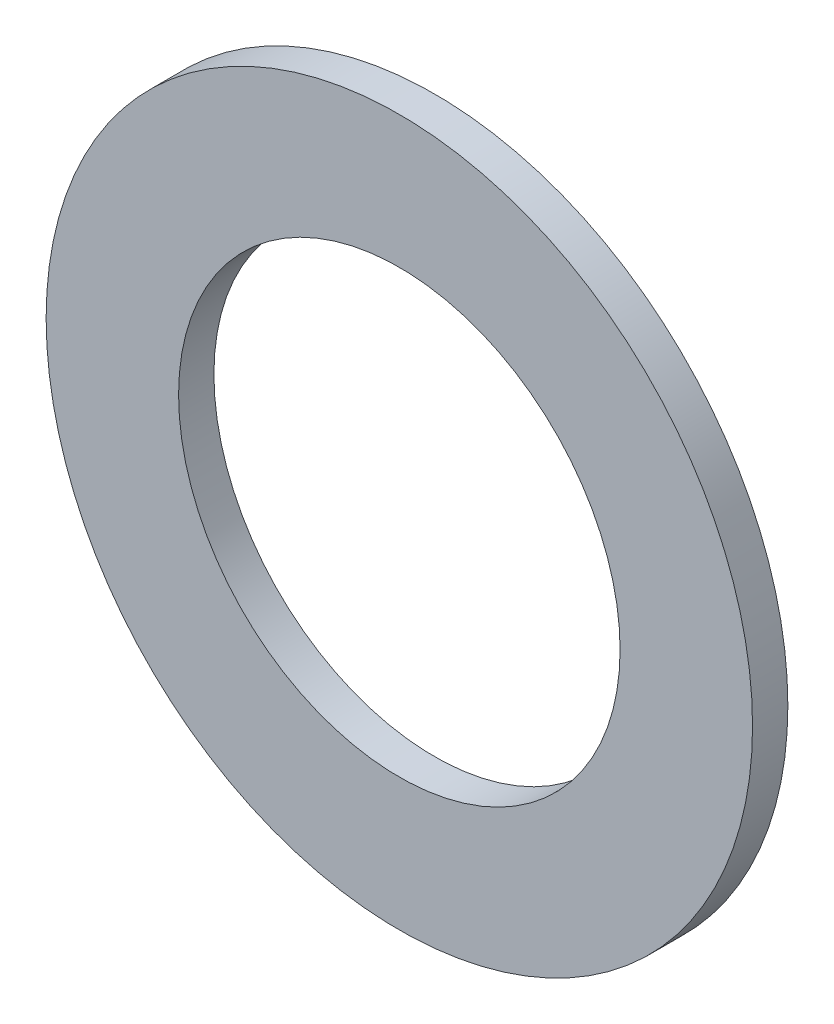
ISO-10303-21;
HEADER;
FILE_DESCRIPTION(('STEP AP214'),'2;1');
FILE_NAME('part.step','',(''),(''),'','','');
FILE_SCHEMA(('AUTOMOTIVE_DESIGN { 1 0 10303 214 1 1 1 1 }'));
ENDSEC;
DATA;
#1=APPLICATION_CONTEXT('core data for automotive mechanical design processes');
#2=APPLICATION_PROTOCOL_DEFINITION('international standard','automotive_design',2000,#1);
#3=PRODUCT_CONTEXT('',#1,'mechanical');
#4=PRODUCT('Part','Part','',(#3));
#5=PRODUCT_RELATED_PRODUCT_CATEGORY('part','',(#4));
#6=PRODUCT_DEFINITION_FORMATION('','',#4);
#7=PRODUCT_DEFINITION_CONTEXT('part definition',#1,'design');
#8=PRODUCT_DEFINITION('design','',#6,#7);
#9=PRODUCT_DEFINITION_SHAPE('','',#8);
#10=(LENGTH_UNIT() NAMED_UNIT(*) SI_UNIT(.MILLI.,.METRE.));
#11=(NAMED_UNIT(*) PLANE_ANGLE_UNIT() SI_UNIT($,.RADIAN.));
#12=(NAMED_UNIT(*) SI_UNIT($,.STERADIAN.) SOLID_ANGLE_UNIT());
#13=UNCERTAINTY_MEASURE_WITH_UNIT(LENGTH_MEASURE(1.E-05),#10,'distance_accuracy_value','');
#14=(GEOMETRIC_REPRESENTATION_CONTEXT(3) GLOBAL_UNCERTAINTY_ASSIGNED_CONTEXT((#13)) GLOBAL_UNIT_ASSIGNED_CONTEXT((#10,
#11,#12)) REPRESENTATION_CONTEXT('',''));
#15=CARTESIAN_POINT('',(0.,0.,0.));
#16=DIRECTION('',(0.,0.,1.));
#17=DIRECTION('',(1.,0.,0.));
#18=AXIS2_PLACEMENT_3D('',#15,#16,#17);
#19=CARTESIAN_POINT('',(0.,0.,2.));
#20=DIRECTION('',(0.,0.,1.));
#21=DIRECTION('',(1.,0.,0.));
#22=AXIS2_PLACEMENT_3D('',#19,#20,#21);
#23=PLANE('',#22);
#24=CARTESIAN_POINT('',(0.,0.,2.));
#25=DIRECTION('',(0.,0.,1.));
#26=DIRECTION('',(1.,0.,0.));
#27=AXIS2_PLACEMENT_3D('',#24,#25,#26);
#28=CIRCLE('',#27,40.);
#29=CARTESIAN_POINT('',(40.,0.,2.));
#30=VERTEX_POINT('',#29);
#31=EDGE_CURVE('E10',#30,#30,#28,.T.);
#32=ORIENTED_EDGE('',*,*,#31,.T.);
#33=EDGE_LOOP('',(#32));
#34=FACE_BOUND('',#33,.T.);
#35=CARTESIAN_POINT('',(0.,0.,2.));
#36=DIRECTION('',(0.,0.,1.));
#37=DIRECTION('',(1.,0.,0.));
#38=AXIS2_PLACEMENT_3D('',#35,#36,#37);
#39=CIRCLE('',#38,25.);
#40=CARTESIAN_POINT('',(25.,0.,2.));
#41=VERTEX_POINT('',#40);
#42=EDGE_CURVE('E41',#41,#41,#39,.T.);
#43=ORIENTED_EDGE('',*,*,#42,.F.);
#44=EDGE_LOOP('',(#43));
#45=FACE_BOUND('',#44,.T.);
#46=ADVANCED_FACE('F30',(#34,#45),#23,.T.);
#47=CARTESIAN_POINT('',(0.,0.,-2.));
#48=DIRECTION('',(0.,0.,1.));
#49=DIRECTION('',(1.,0.,0.));
#50=AXIS2_PLACEMENT_3D('',#47,#48,#49);
#51=PLANE('',#50);
#52=CARTESIAN_POINT('',(0.,0.,-2.));
#53=DIRECTION('',(0.,0.,1.));
#54=DIRECTION('',(1.,0.,0.));
#55=AXIS2_PLACEMENT_3D('',#52,#53,#54);
#56=CIRCLE('',#55,40.);
#57=CARTESIAN_POINT('',(40.,0.,-2.));
#58=VERTEX_POINT('',#57);
#59=EDGE_CURVE('E37',#58,#58,#56,.T.);
#60=ORIENTED_EDGE('',*,*,#59,.F.);
#61=EDGE_LOOP('',(#60));
#62=FACE_BOUND('',#61,.T.);
#63=CARTESIAN_POINT('',(0.,0.,-2.));
#64=DIRECTION('',(0.,0.,1.));
#65=DIRECTION('',(1.,0.,0.));
#66=AXIS2_PLACEMENT_3D('',#63,#64,#65);
#67=CIRCLE('',#66,25.);
#68=CARTESIAN_POINT('',(25.,0.,-2.));
#69=VERTEX_POINT('',#68);
#70=EDGE_CURVE('E45',#69,#69,#67,.T.);
#71=ORIENTED_EDGE('',*,*,#70,.T.);
#72=EDGE_LOOP('',(#71));
#73=FACE_BOUND('',#72,.T.);
#74=ADVANCED_FACE('F51',(#62,#73),#51,.F.);
#75=CARTESIAN_POINT('',(0.,0.,2.));
#76=DIRECTION('',(0.,0.,-1.));
#77=DIRECTION('',(-1.,0.,0.));
#78=AXIS2_PLACEMENT_3D('',#75,#76,#77);
#79=CYLINDRICAL_SURFACE('',#78,40.);
#80=ORIENTED_EDGE('',*,*,#31,.F.);
#81=EDGE_LOOP('',(#80));
#82=FACE_BOUND('',#81,.T.);
#83=ORIENTED_EDGE('',*,*,#59,.T.);
#84=EDGE_LOOP('',(#83));
#85=FACE_BOUND('',#84,.T.);
#86=ADVANCED_FACE('F32',(#82,#85),#79,.T.);
#87=CARTESIAN_POINT('',(0.,0.,2.));
#88=DIRECTION('',(0.,0.,-1.));
#89=DIRECTION('',(-1.,0.,0.));
#90=AXIS2_PLACEMENT_3D('',#87,#88,#89);
#91=CYLINDRICAL_SURFACE('',#90,25.);
#92=ORIENTED_EDGE('',*,*,#42,.T.);
#93=EDGE_LOOP('',(#92));
#94=FACE_BOUND('',#93,.T.);
#95=ORIENTED_EDGE('',*,*,#70,.F.);
#96=EDGE_LOOP('',(#95));
#97=FACE_BOUND('',#96,.T.);
#98=ADVANCED_FACE('F53',(#94,#97),#91,.F.);
#99=CLOSED_SHELL('',(#46,#74,#86,#98));
#100=MANIFOLD_SOLID_BREP('B2',#99);
#101=ADVANCED_BREP_SHAPE_REPRESENTATION('',(#18,#100),#14);
#102=SHAPE_DEFINITION_REPRESENTATION(#9,#101);
ENDSEC;
END-ISO-10303-21;
